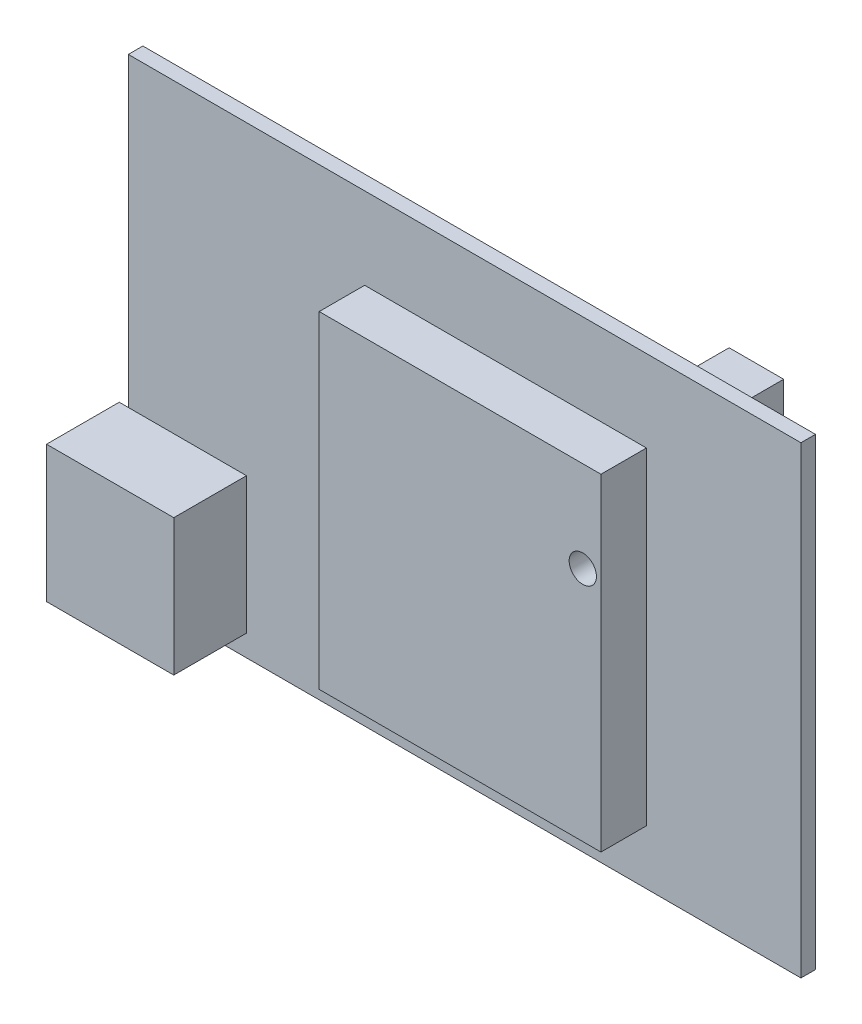
ISO-10303-21;
HEADER;
FILE_DESCRIPTION(('STEP AP214'),'2;1');
FILE_NAME('part.step','',(''),(''),'','','');
FILE_SCHEMA(('AUTOMOTIVE_DESIGN { 1 0 10303 214 1 1 1 1 }'));
ENDSEC;
DATA;
#1=APPLICATION_CONTEXT('core data for automotive mechanical design processes');
#2=APPLICATION_PROTOCOL_DEFINITION('international standard','automotive_design',2000,#1);
#3=PRODUCT_CONTEXT('',#1,'mechanical');
#4=PRODUCT('Part','Part','',(#3));
#5=PRODUCT_RELATED_PRODUCT_CATEGORY('part','',(#4));
#6=PRODUCT_DEFINITION_FORMATION('','',#4);
#7=PRODUCT_DEFINITION_CONTEXT('part definition',#1,'design');
#8=PRODUCT_DEFINITION('design','',#6,#7);
#9=PRODUCT_DEFINITION_SHAPE('','',#8);
#10=(LENGTH_UNIT() NAMED_UNIT(*) SI_UNIT(.MILLI.,.METRE.));
#11=(NAMED_UNIT(*) PLANE_ANGLE_UNIT() SI_UNIT($,.RADIAN.));
#12=(NAMED_UNIT(*) SI_UNIT($,.STERADIAN.) SOLID_ANGLE_UNIT());
#13=UNCERTAINTY_MEASURE_WITH_UNIT(LENGTH_MEASURE(1.E-05),#10,'distance_accuracy_value','');
#14=(GEOMETRIC_REPRESENTATION_CONTEXT(3) GLOBAL_UNCERTAINTY_ASSIGNED_CONTEXT((#13)) GLOBAL_UNIT_ASSIGNED_CONTEXT((#10,
#11,#12)) REPRESENTATION_CONTEXT('',''));
#15=CARTESIAN_POINT('',(0.,0.,0.));
#16=DIRECTION('',(0.,0.,1.));
#17=DIRECTION('',(1.,0.,0.));
#18=AXIS2_PLACEMENT_3D('',#15,#16,#17);
#19=CARTESIAN_POINT('',(0.,0.,0.));
#20=DIRECTION('',(0.,0.,-1.));
#21=DIRECTION('',(-1.,0.,0.));
#22=AXIS2_PLACEMENT_3D('',#19,#20,#21);
#23=PLANE('',#22);
#24=CARTESIAN_POINT('',(55.,32.,0.));
#25=DIRECTION('',(0.,0.,-1.));
#26=DIRECTION('',(-1.,0.,0.));
#27=AXIS2_PLACEMENT_3D('',#24,#25,#26);
#28=CIRCLE('',#27,1.5);
#29=CARTESIAN_POINT('',(53.5,32.,0.));
#30=VERTEX_POINT('',#29);
#31=EDGE_CURVE('E280',#30,#30,#28,.F.);
#32=ORIENTED_EDGE('',*,*,#31,.T.);
#33=EDGE_LOOP('',(#32));
#34=FACE_BOUND('',#33,.T.);
#35=CARTESIAN_POINT('',(24.,25.5,0.));
#36=DIRECTION('',(0.,0.,-1.));
#37=DIRECTION('',(-1.,0.,0.));
#38=AXIS2_PLACEMENT_3D('',#35,#36,#37);
#39=CIRCLE('',#38,1.5);
#40=CARTESIAN_POINT('',(22.5,25.5,0.));
#41=VERTEX_POINT('',#40);
#42=EDGE_CURVE('E288',#41,#41,#39,.F.);
#43=ORIENTED_EDGE('',*,*,#42,.T.);
#44=EDGE_LOOP('',(#43));
#45=FACE_BOUND('',#44,.T.);
#46=DIRECTION('',(0.,-1.,0.));
#47=VECTOR('',#46,1.);
#48=CARTESIAN_POINT('',(0.,0.,0.));
#49=LINE('',#48,#47);
#50=CARTESIAN_POINT('',(0.,51.,0.));
#51=VERTEX_POINT('',#50);
#52=CARTESIAN_POINT('',(0.,0.,0.));
#53=VERTEX_POINT('',#52);
#54=EDGE_CURVE('E251',#51,#53,#49,.T.);
#55=ORIENTED_EDGE('',*,*,#54,.F.);
#56=DIRECTION('',(-1.,0.,0.));
#57=VECTOR('',#56,1.);
#58=CARTESIAN_POINT('',(0.,51.,0.));
#59=LINE('',#58,#57);
#60=CARTESIAN_POINT('',(74.,51.,0.));
#61=VERTEX_POINT('',#60);
#62=EDGE_CURVE('E270',#61,#51,#59,.T.);
#63=ORIENTED_EDGE('',*,*,#62,.F.);
#64=DIRECTION('',(0.,1.,0.));
#65=VECTOR('',#64,1.);
#66=CARTESIAN_POINT('',(74.,0.,0.));
#67=LINE('',#66,#65);
#68=CARTESIAN_POINT('',(74.,0.,0.));
#69=VERTEX_POINT('',#68);
#70=EDGE_CURVE('E268',#69,#61,#67,.T.);
#71=ORIENTED_EDGE('',*,*,#70,.F.);
#72=DIRECTION('',(1.,0.,0.));
#73=VECTOR('',#72,1.);
#74=CARTESIAN_POINT('',(0.,0.,0.));
#75=LINE('',#74,#73);
#76=EDGE_CURVE('E266',#53,#69,#75,.T.);
#77=ORIENTED_EDGE('',*,*,#76,.F.);
#78=EDGE_LOOP('',(#55,#63,#71,#77));
#79=FACE_BOUND('',#78,.T.);
#80=DIRECTION('',(-1.,0.,0.));
#81=VECTOR('',#80,1.);
#82=CARTESIAN_POINT('',(66.,1.,0.));
#83=LINE('',#82,#81);
#84=CARTESIAN_POINT('',(66.,1.,0.));
#85=VERTEX_POINT('',#84);
#86=CARTESIAN_POINT('',(60.,1.,0.));
#87=VERTEX_POINT('',#86);
#88=EDGE_CURVE('E296',#85,#87,#83,.T.);
#89=ORIENTED_EDGE('',*,*,#88,.F.);
#90=DIRECTION('',(0.,-1.,0.));
#91=VECTOR('',#90,1.);
#92=CARTESIAN_POINT('',(66.,50.,0.));
#93=LINE('',#92,#91);
#94=CARTESIAN_POINT('',(66.,50.,0.));
#95=VERTEX_POINT('',#94);
#96=EDGE_CURVE('E179',#95,#85,#93,.T.);
#97=ORIENTED_EDGE('',*,*,#96,.F.);
#98=DIRECTION('',(1.,0.,0.));
#99=VECTOR('',#98,1.);
#100=CARTESIAN_POINT('',(66.,50.,0.));
#101=LINE('',#100,#99);
#102=CARTESIAN_POINT('',(60.,50.,0.));
#103=VERTEX_POINT('',#102);
#104=EDGE_CURVE('E175',#103,#95,#101,.T.);
#105=ORIENTED_EDGE('',*,*,#104,.F.);
#106=DIRECTION('',(0.,1.,0.));
#107=VECTOR('',#106,1.);
#108=CARTESIAN_POINT('',(60.,50.,0.));
#109=LINE('',#108,#107);
#110=EDGE_CURVE('E298',#87,#103,#109,.T.);
#111=ORIENTED_EDGE('',*,*,#110,.F.);
#112=EDGE_LOOP('',(#89,#97,#105,#111));
#113=FACE_BOUND('',#112,.T.);
#114=ADVANCED_FACE('F34',(#34,#45,#79,#113),#23,.T.);
#115=CARTESIAN_POINT('',(0.,0.,1.6));
#116=DIRECTION('',(0.,0.,-1.));
#117=DIRECTION('',(-1.,0.,0.));
#118=AXIS2_PLACEMENT_3D('',#115,#116,#117);
#119=PLANE('',#118);
#120=CARTESIAN_POINT('',(24.,25.5,1.6));
#121=DIRECTION('',(0.,0.,-1.));
#122=DIRECTION('',(-1.,0.,0.));
#123=AXIS2_PLACEMENT_3D('',#120,#121,#122);
#124=CIRCLE('',#123,1.5);
#125=CARTESIAN_POINT('',(22.5,25.5,1.6));
#126=VERTEX_POINT('',#125);
#127=EDGE_CURVE('E38',#126,#126,#124,.F.);
#128=ORIENTED_EDGE('',*,*,#127,.F.);
#129=EDGE_LOOP('',(#128));
#130=FACE_BOUND('',#129,.T.);
#131=DIRECTION('',(0.,-1.,0.));
#132=VECTOR('',#131,1.);
#133=CARTESIAN_POINT('',(26.,42.,1.6));
#134=LINE('',#133,#132);
#135=CARTESIAN_POINT('',(26.,42.,1.6));
#136=VERTEX_POINT('',#135);
#137=CARTESIAN_POINT('',(26.,6.,1.6));
#138=VERTEX_POINT('',#137);
#139=EDGE_CURVE('E218',#136,#138,#134,.T.);
#140=ORIENTED_EDGE('',*,*,#139,.F.);
#141=DIRECTION('',(-1.,0.,0.));
#142=VECTOR('',#141,1.);
#143=CARTESIAN_POINT('',(26.,42.,1.6));
#144=LINE('',#143,#142);
#145=CARTESIAN_POINT('',(57.,42.,1.6));
#146=VERTEX_POINT('',#145);
#147=EDGE_CURVE('E223',#146,#136,#144,.T.);
#148=ORIENTED_EDGE('',*,*,#147,.F.);
#149=DIRECTION('',(0.,1.,0.));
#150=VECTOR('',#149,1.);
#151=CARTESIAN_POINT('',(57.,42.,1.6));
#152=LINE('',#151,#150);
#153=CARTESIAN_POINT('',(57.,6.,1.6));
#154=VERTEX_POINT('',#153);
#155=EDGE_CURVE('E235',#154,#146,#152,.T.);
#156=ORIENTED_EDGE('',*,*,#155,.F.);
#157=DIRECTION('',(1.,0.,0.));
#158=VECTOR('',#157,1.);
#159=CARTESIAN_POINT('',(26.,6.,1.6));
#160=LINE('',#159,#158);
#161=EDGE_CURVE('E232',#138,#154,#160,.T.);
#162=ORIENTED_EDGE('',*,*,#161,.F.);
#163=EDGE_LOOP('',(#140,#148,#156,#162));
#164=FACE_BOUND('',#163,.T.);
#165=DIRECTION('',(1.,0.,0.));
#166=VECTOR('',#165,1.);
#167=CARTESIAN_POINT('',(-0.999999999999999,2.36,1.6));
#168=LINE('',#167,#166);
#169=CARTESIAN_POINT('',(0.,2.36,1.6));
#170=VERTEX_POINT('',#169);
#171=CARTESIAN_POINT('',(13.,2.36,1.6));
#172=VERTEX_POINT('',#171);
#173=EDGE_CURVE('E184',#170,#172,#168,.T.);
#174=ORIENTED_EDGE('',*,*,#173,.F.);
#175=DIRECTION('',(0.,-1.,0.));
#176=VECTOR('',#175,1.);
#177=CARTESIAN_POINT('',(0.,0.,1.6));
#178=LINE('',#177,#176);
#179=CARTESIAN_POINT('',(0.,0.,1.6));
#180=VERTEX_POINT('',#179);
#181=EDGE_CURVE('E257',#170,#180,#178,.T.);
#182=ORIENTED_EDGE('',*,*,#181,.T.);
#183=DIRECTION('',(1.,0.,0.));
#184=VECTOR('',#183,1.);
#185=CARTESIAN_POINT('',(0.,0.,1.6));
#186=LINE('',#185,#184);
#187=CARTESIAN_POINT('',(74.,0.,1.6));
#188=VERTEX_POINT('',#187);
#189=EDGE_CURVE('E255',#180,#188,#186,.T.);
#190=ORIENTED_EDGE('',*,*,#189,.T.);
#191=DIRECTION('',(0.,1.,0.));
#192=VECTOR('',#191,1.);
#193=CARTESIAN_POINT('',(74.,0.,1.6));
#194=LINE('',#193,#192);
#195=CARTESIAN_POINT('',(74.,51.,1.6));
#196=VERTEX_POINT('',#195);
#197=EDGE_CURVE('E259',#188,#196,#194,.T.);
#198=ORIENTED_EDGE('',*,*,#197,.T.);
#199=DIRECTION('',(-1.,0.,0.));
#200=VECTOR('',#199,1.);
#201=CARTESIAN_POINT('',(0.,51.,1.6));
#202=LINE('',#201,#200);
#203=CARTESIAN_POINT('',(0.,51.,1.6));
#204=VERTEX_POINT('',#203);
#205=EDGE_CURVE('E261',#196,#204,#202,.T.);
#206=ORIENTED_EDGE('',*,*,#205,.T.);
#207=CARTESIAN_POINT('',(0.,17.36,1.6));
#208=VERTEX_POINT('',#207);
#209=EDGE_CURVE('E252',#204,#208,#178,.T.);
#210=ORIENTED_EDGE('',*,*,#209,.T.);
#211=DIRECTION('',(-1.,0.,0.));
#212=VECTOR('',#211,1.);
#213=CARTESIAN_POINT('',(-1.,17.36,1.6));
#214=LINE('',#213,#212);
#215=CARTESIAN_POINT('',(13.,17.36,1.6));
#216=VERTEX_POINT('',#215);
#217=EDGE_CURVE('E193',#216,#208,#214,.T.);
#218=ORIENTED_EDGE('',*,*,#217,.F.);
#219=DIRECTION('',(0.,1.,0.));
#220=VECTOR('',#219,1.);
#221=CARTESIAN_POINT('',(13.,17.36,1.6));
#222=LINE('',#221,#220);
#223=EDGE_CURVE('E59',#172,#216,#222,.T.);
#224=ORIENTED_EDGE('',*,*,#223,.F.);
#225=EDGE_LOOP('',(#174,#182,#190,#198,#206,#210,#218,#224));
#226=FACE_BOUND('',#225,.T.);
#227=ADVANCED_FACE('F317',(#130,#164,#226),#119,.F.);
#228=CARTESIAN_POINT('',(0.,0.,1.6));
#229=DIRECTION('',(1.,0.,0.));
#230=DIRECTION('',(0.,0.,-1.));
#231=AXIS2_PLACEMENT_3D('',#228,#229,#230);
#232=PLANE('',#231);
#233=ORIENTED_EDGE('',*,*,#54,.T.);
#234=DIRECTION('',(0.,0.,-1.));
#235=VECTOR('',#234,1.);
#236=CARTESIAN_POINT('',(0.,0.,1.6));
#237=LINE('',#236,#235);
#238=EDGE_CURVE('E11',#180,#53,#237,.T.);
#239=ORIENTED_EDGE('',*,*,#238,.F.);
#240=ORIENTED_EDGE('',*,*,#181,.F.);
#241=EDGE_CURVE('E256',#208,#170,#178,.T.);
#242=ORIENTED_EDGE('',*,*,#241,.F.);
#243=ORIENTED_EDGE('',*,*,#209,.F.);
#244=DIRECTION('',(0.,0.,-1.));
#245=VECTOR('',#244,1.);
#246=CARTESIAN_POINT('',(0.,51.,1.6));
#247=LINE('',#246,#245);
#248=EDGE_CURVE('E263',#204,#51,#247,.T.);
#249=ORIENTED_EDGE('',*,*,#248,.T.);
#250=EDGE_LOOP('',(#233,#239,#240,#242,#243,#249));
#251=FACE_BOUND('',#250,.T.);
#252=ADVANCED_FACE('F36',(#251),#232,.F.);
#253=CARTESIAN_POINT('',(0.,0.,1.6));
#254=DIRECTION('',(0.,1.,0.));
#255=DIRECTION('',(0.,0.,1.));
#256=AXIS2_PLACEMENT_3D('',#253,#254,#255);
#257=PLANE('',#256);
#258=ORIENTED_EDGE('',*,*,#76,.T.);
#259=DIRECTION('',(0.,0.,-1.));
#260=VECTOR('',#259,1.);
#261=CARTESIAN_POINT('',(74.,0.,1.6));
#262=LINE('',#261,#260);
#263=EDGE_CURVE('E43',#188,#69,#262,.T.);
#264=ORIENTED_EDGE('',*,*,#263,.F.);
#265=ORIENTED_EDGE('',*,*,#189,.F.);
#266=ORIENTED_EDGE('',*,*,#238,.T.);
#267=EDGE_LOOP('',(#258,#264,#265,#266));
#268=FACE_BOUND('',#267,.T.);
#269=ADVANCED_FACE('F334',(#268),#257,.F.);
#270=CARTESIAN_POINT('',(74.,0.,1.6));
#271=DIRECTION('',(-1.,0.,0.));
#272=DIRECTION('',(0.,0.,1.));
#273=AXIS2_PLACEMENT_3D('',#270,#271,#272);
#274=PLANE('',#273);
#275=ORIENTED_EDGE('',*,*,#70,.T.);
#276=DIRECTION('',(0.,0.,-1.));
#277=VECTOR('',#276,1.);
#278=CARTESIAN_POINT('',(74.,51.,1.6));
#279=LINE('',#278,#277);
#280=EDGE_CURVE('E274',#196,#61,#279,.T.);
#281=ORIENTED_EDGE('',*,*,#280,.F.);
#282=ORIENTED_EDGE('',*,*,#197,.F.);
#283=ORIENTED_EDGE('',*,*,#263,.T.);
#284=EDGE_LOOP('',(#275,#281,#282,#283));
#285=FACE_BOUND('',#284,.T.);
#286=ADVANCED_FACE('F331',(#285),#274,.F.);
#287=CARTESIAN_POINT('',(0.,51.,1.6));
#288=DIRECTION('',(0.,-1.,0.));
#289=DIRECTION('',(0.,0.,-1.));
#290=AXIS2_PLACEMENT_3D('',#287,#288,#289);
#291=PLANE('',#290);
#292=ORIENTED_EDGE('',*,*,#62,.T.);
#293=ORIENTED_EDGE('',*,*,#248,.F.);
#294=ORIENTED_EDGE('',*,*,#205,.F.);
#295=ORIENTED_EDGE('',*,*,#280,.T.);
#296=EDGE_LOOP('',(#292,#293,#294,#295));
#297=FACE_BOUND('',#296,.T.);
#298=ADVANCED_FACE('F327',(#297),#291,.F.);
#299=CARTESIAN_POINT('',(26.,42.,6.6));
#300=DIRECTION('',(1.,0.,0.));
#301=DIRECTION('',(0.,1.,0.));
#302=AXIS2_PLACEMENT_3D('',#299,#300,#301);
#303=PLANE('',#302);
#304=ORIENTED_EDGE('',*,*,#139,.T.);
#305=DIRECTION('',(0.,0.,-1.));
#306=VECTOR('',#305,1.);
#307=CARTESIAN_POINT('',(26.,6.,6.6));
#308=LINE('',#307,#306);
#309=CARTESIAN_POINT('',(26.,6.,6.6));
#310=VERTEX_POINT('',#309);
#311=EDGE_CURVE('E248',#310,#138,#308,.T.);
#312=ORIENTED_EDGE('',*,*,#311,.F.);
#313=DIRECTION('',(0.,-1.,0.));
#314=VECTOR('',#313,1.);
#315=CARTESIAN_POINT('',(26.,42.,6.6));
#316=LINE('',#315,#314);
#317=CARTESIAN_POINT('',(26.,42.,6.6));
#318=VERTEX_POINT('',#317);
#319=EDGE_CURVE('E219',#318,#310,#316,.T.);
#320=ORIENTED_EDGE('',*,*,#319,.F.);
#321=DIRECTION('',(0.,0.,-1.));
#322=VECTOR('',#321,1.);
#323=CARTESIAN_POINT('',(26.,42.,6.6));
#324=LINE('',#323,#322);
#325=EDGE_CURVE('E229',#318,#136,#324,.T.);
#326=ORIENTED_EDGE('',*,*,#325,.T.);
#327=EDGE_LOOP('',(#304,#312,#320,#326));
#328=FACE_BOUND('',#327,.T.);
#329=ADVANCED_FACE('F330',(#328),#303,.F.);
#330=CARTESIAN_POINT('',(26.,6.,6.6));
#331=DIRECTION('',(0.,1.,0.));
#332=DIRECTION('',(0.,0.,1.));
#333=AXIS2_PLACEMENT_3D('',#330,#331,#332);
#334=PLANE('',#333);
#335=ORIENTED_EDGE('',*,*,#161,.T.);
#336=DIRECTION('',(0.,0.,-1.));
#337=VECTOR('',#336,1.);
#338=CARTESIAN_POINT('',(57.,6.,6.6));
#339=LINE('',#338,#337);
#340=CARTESIAN_POINT('',(57.,6.,6.6));
#341=VERTEX_POINT('',#340);
#342=EDGE_CURVE('E245',#341,#154,#339,.T.);
#343=ORIENTED_EDGE('',*,*,#342,.F.);
#344=DIRECTION('',(1.,0.,0.));
#345=VECTOR('',#344,1.);
#346=CARTESIAN_POINT('',(26.,6.,6.6));
#347=LINE('',#346,#345);
#348=EDGE_CURVE('E222',#310,#341,#347,.T.);
#349=ORIENTED_EDGE('',*,*,#348,.F.);
#350=ORIENTED_EDGE('',*,*,#311,.T.);
#351=EDGE_LOOP('',(#335,#343,#349,#350));
#352=FACE_BOUND('',#351,.T.);
#353=ADVANCED_FACE('F404',(#352),#334,.F.);
#354=CARTESIAN_POINT('',(57.,42.,6.6));
#355=DIRECTION('',(-1.,0.,0.));
#356=DIRECTION('',(0.,-1.,0.));
#357=AXIS2_PLACEMENT_3D('',#354,#355,#356);
#358=PLANE('',#357);
#359=ORIENTED_EDGE('',*,*,#155,.T.);
#360=DIRECTION('',(0.,0.,-1.));
#361=VECTOR('',#360,1.);
#362=CARTESIAN_POINT('',(57.,42.,6.6));
#363=LINE('',#362,#361);
#364=CARTESIAN_POINT('',(57.,42.,6.6));
#365=VERTEX_POINT('',#364);
#366=EDGE_CURVE('E242',#365,#146,#363,.T.);
#367=ORIENTED_EDGE('',*,*,#366,.F.);
#368=DIRECTION('',(0.,1.,0.));
#369=VECTOR('',#368,1.);
#370=CARTESIAN_POINT('',(57.,42.,6.6));
#371=LINE('',#370,#369);
#372=EDGE_CURVE('E225',#341,#365,#371,.T.);
#373=ORIENTED_EDGE('',*,*,#372,.F.);
#374=ORIENTED_EDGE('',*,*,#342,.T.);
#375=EDGE_LOOP('',(#359,#367,#373,#374));
#376=FACE_BOUND('',#375,.T.);
#377=ADVANCED_FACE('F400',(#376),#358,.F.);
#378=CARTESIAN_POINT('',(26.,42.,6.6));
#379=DIRECTION('',(0.,-1.,0.));
#380=DIRECTION('',(0.,0.,-1.));
#381=AXIS2_PLACEMENT_3D('',#378,#379,#380);
#382=PLANE('',#381);
#383=ORIENTED_EDGE('',*,*,#147,.T.);
#384=ORIENTED_EDGE('',*,*,#325,.F.);
#385=DIRECTION('',(-1.,0.,0.));
#386=VECTOR('',#385,1.);
#387=CARTESIAN_POINT('',(26.,42.,6.6));
#388=LINE('',#387,#386);
#389=EDGE_CURVE('E227',#365,#318,#388,.T.);
#390=ORIENTED_EDGE('',*,*,#389,.F.);
#391=ORIENTED_EDGE('',*,*,#366,.T.);
#392=EDGE_LOOP('',(#383,#384,#390,#391));
#393=FACE_BOUND('',#392,.T.);
#394=ADVANCED_FACE('F397',(#393),#382,.F.);
#395=CARTESIAN_POINT('',(0.,0.,6.6));
#396=DIRECTION('',(0.,0.,1.));
#397=DIRECTION('',(1.,0.,0.));
#398=AXIS2_PLACEMENT_3D('',#395,#396,#397);
#399=PLANE('',#398);
#400=CARTESIAN_POINT('',(55.,32.,6.6));
#401=DIRECTION('',(0.,0.,1.));
#402=DIRECTION('',(1.,0.,0.));
#403=AXIS2_PLACEMENT_3D('',#400,#401,#402);
#404=CIRCLE('',#403,1.5);
#405=CARTESIAN_POINT('',(56.5,32.,6.6));
#406=VERTEX_POINT('',#405);
#407=EDGE_CURVE('E278',#406,#406,#404,.F.);
#408=ORIENTED_EDGE('',*,*,#407,.T.);
#409=EDGE_LOOP('',(#408));
#410=FACE_BOUND('',#409,.T.);
#411=ORIENTED_EDGE('',*,*,#319,.T.);
#412=ORIENTED_EDGE('',*,*,#348,.T.);
#413=ORIENTED_EDGE('',*,*,#372,.T.);
#414=ORIENTED_EDGE('',*,*,#389,.T.);
#415=EDGE_LOOP('',(#411,#412,#413,#414));
#416=FACE_BOUND('',#415,.T.);
#417=ADVANCED_FACE('F387',(#410,#416),#399,.T.);
#418=CARTESIAN_POINT('',(0.,0.,1.6));
#419=DIRECTION('',(0.,0.,1.));
#420=DIRECTION('',(1.,0.,0.));
#421=AXIS2_PLACEMENT_3D('',#418,#419,#420);
#422=PLANE('',#421);
#423=CARTESIAN_POINT('',(-1.,17.36,1.6));
#424=VERTEX_POINT('',#423);
#425=EDGE_CURVE('E204',#208,#424,#214,.T.);
#426=ORIENTED_EDGE('',*,*,#425,.F.);
#427=ORIENTED_EDGE('',*,*,#241,.T.);
#428=CARTESIAN_POINT('',(-0.999999999999999,2.36,1.6));
#429=VERTEX_POINT('',#428);
#430=EDGE_CURVE('E200',#429,#170,#168,.T.);
#431=ORIENTED_EDGE('',*,*,#430,.F.);
#432=DIRECTION('',(0.,-1.,0.));
#433=VECTOR('',#432,1.);
#434=CARTESIAN_POINT('',(-1.,17.36,1.6));
#435=LINE('',#434,#433);
#436=EDGE_CURVE('E181',#424,#429,#435,.T.);
#437=ORIENTED_EDGE('',*,*,#436,.F.);
#438=EDGE_LOOP('',(#426,#427,#431,#437));
#439=FACE_BOUND('',#438,.T.);
#440=ADVANCED_FACE('F358',(#439),#422,.F.);
#441=CARTESIAN_POINT('',(-1.,17.36,9.6));
#442=DIRECTION('',(1.,0.,0.));
#443=DIRECTION('',(0.,1.,0.));
#444=AXIS2_PLACEMENT_3D('',#441,#442,#443);
#445=PLANE('',#444);
#446=ORIENTED_EDGE('',*,*,#436,.T.);
#447=DIRECTION('',(0.,0.,-1.));
#448=VECTOR('',#447,1.);
#449=CARTESIAN_POINT('',(-0.999999999999999,2.36,9.6));
#450=LINE('',#449,#448);
#451=CARTESIAN_POINT('',(-0.999999999999999,2.36,9.6));
#452=VERTEX_POINT('',#451);
#453=EDGE_CURVE('E215',#452,#429,#450,.T.);
#454=ORIENTED_EDGE('',*,*,#453,.F.);
#455=DIRECTION('',(0.,-1.,0.));
#456=VECTOR('',#455,1.);
#457=CARTESIAN_POINT('',(-1.,17.36,9.6));
#458=LINE('',#457,#456);
#459=CARTESIAN_POINT('',(-1.,17.36,9.6));
#460=VERTEX_POINT('',#459);
#461=EDGE_CURVE('E189',#460,#452,#458,.T.);
#462=ORIENTED_EDGE('',*,*,#461,.F.);
#463=DIRECTION('',(0.,0.,-1.));
#464=VECTOR('',#463,1.);
#465=CARTESIAN_POINT('',(-1.,17.36,9.6));
#466=LINE('',#465,#464);
#467=EDGE_CURVE('E198',#460,#424,#466,.T.);
#468=ORIENTED_EDGE('',*,*,#467,.T.);
#469=EDGE_LOOP('',(#446,#454,#462,#468));
#470=FACE_BOUND('',#469,.T.);
#471=ADVANCED_FACE('F373',(#470),#445,.F.);
#472=CARTESIAN_POINT('',(-0.999999999999999,2.36,9.6));
#473=DIRECTION('',(0.,1.,0.));
#474=DIRECTION('',(-1.,0.,0.));
#475=AXIS2_PLACEMENT_3D('',#472,#473,#474);
#476=PLANE('',#475);
#477=ORIENTED_EDGE('',*,*,#430,.T.);
#478=ORIENTED_EDGE('',*,*,#173,.T.);
#479=DIRECTION('',(0.,0.,-1.));
#480=VECTOR('',#479,1.);
#481=CARTESIAN_POINT('',(13.,2.36,9.6));
#482=LINE('',#481,#480);
#483=CARTESIAN_POINT('',(13.,2.36,9.6));
#484=VERTEX_POINT('',#483);
#485=EDGE_CURVE('E212',#484,#172,#482,.T.);
#486=ORIENTED_EDGE('',*,*,#485,.F.);
#487=DIRECTION('',(1.,0.,0.));
#488=VECTOR('',#487,1.);
#489=CARTESIAN_POINT('',(-0.999999999999999,2.36,9.6));
#490=LINE('',#489,#488);
#491=EDGE_CURVE('E192',#452,#484,#490,.T.);
#492=ORIENTED_EDGE('',*,*,#491,.F.);
#493=ORIENTED_EDGE('',*,*,#453,.T.);
#494=EDGE_LOOP('',(#477,#478,#486,#492,#493));
#495=FACE_BOUND('',#494,.T.);
#496=ADVANCED_FACE('F369',(#495),#476,.F.);
#497=CARTESIAN_POINT('',(13.,17.36,9.6));
#498=DIRECTION('',(-1.,0.,0.));
#499=DIRECTION('',(0.,-1.,0.));
#500=AXIS2_PLACEMENT_3D('',#497,#498,#499);
#501=PLANE('',#500);
#502=ORIENTED_EDGE('',*,*,#223,.T.);
#503=DIRECTION('',(0.,0.,-1.));
#504=VECTOR('',#503,1.);
#505=CARTESIAN_POINT('',(13.,17.36,9.6));
#506=LINE('',#505,#504);
#507=CARTESIAN_POINT('',(13.,17.36,9.6));
#508=VERTEX_POINT('',#507);
#509=EDGE_CURVE('E209',#508,#216,#506,.T.);
#510=ORIENTED_EDGE('',*,*,#509,.F.);
#511=DIRECTION('',(0.,1.,0.));
#512=VECTOR('',#511,1.);
#513=CARTESIAN_POINT('',(13.,17.36,9.6));
#514=LINE('',#513,#512);
#515=EDGE_CURVE('E195',#484,#508,#514,.T.);
#516=ORIENTED_EDGE('',*,*,#515,.F.);
#517=ORIENTED_EDGE('',*,*,#485,.T.);
#518=EDGE_LOOP('',(#502,#510,#516,#517));
#519=FACE_BOUND('',#518,.T.);
#520=ADVANCED_FACE('F366',(#519),#501,.F.);
#521=CARTESIAN_POINT('',(-1.,17.36,9.6));
#522=DIRECTION('',(0.,-1.,0.));
#523=DIRECTION('',(0.,0.,-1.));
#524=AXIS2_PLACEMENT_3D('',#521,#522,#523);
#525=PLANE('',#524);
#526=ORIENTED_EDGE('',*,*,#217,.T.);
#527=ORIENTED_EDGE('',*,*,#425,.T.);
#528=ORIENTED_EDGE('',*,*,#467,.F.);
#529=DIRECTION('',(-1.,0.,0.));
#530=VECTOR('',#529,1.);
#531=CARTESIAN_POINT('',(-1.,17.36,9.6));
#532=LINE('',#531,#530);
#533=EDGE_CURVE('E197',#508,#460,#532,.T.);
#534=ORIENTED_EDGE('',*,*,#533,.F.);
#535=ORIENTED_EDGE('',*,*,#509,.T.);
#536=EDGE_LOOP('',(#526,#527,#528,#534,#535));
#537=FACE_BOUND('',#536,.T.);
#538=ADVANCED_FACE('F361',(#537),#525,.F.);
#539=CARTESIAN_POINT('',(0.,0.,9.6));
#540=DIRECTION('',(0.,0.,1.));
#541=DIRECTION('',(1.,0.,0.));
#542=AXIS2_PLACEMENT_3D('',#539,#540,#541);
#543=PLANE('',#542);
#544=ORIENTED_EDGE('',*,*,#461,.T.);
#545=ORIENTED_EDGE('',*,*,#491,.T.);
#546=ORIENTED_EDGE('',*,*,#515,.T.);
#547=ORIENTED_EDGE('',*,*,#533,.T.);
#548=EDGE_LOOP('',(#544,#545,#546,#547));
#549=FACE_BOUND('',#548,.T.);
#550=ADVANCED_FACE('F375',(#549),#543,.T.);
#551=CARTESIAN_POINT('',(66.,50.,-4.5));
#552=DIRECTION('',(-1.,0.,0.));
#553=DIRECTION('',(0.,0.,1.));
#554=AXIS2_PLACEMENT_3D('',#551,#552,#553);
#555=PLANE('',#554);
#556=ORIENTED_EDGE('',*,*,#96,.T.);
#557=DIRECTION('',(0.,0.,1.));
#558=VECTOR('',#557,1.);
#559=CARTESIAN_POINT('',(66.,1.,-4.5));
#560=LINE('',#559,#558);
#561=CARTESIAN_POINT('',(66.,1.,-4.5));
#562=VERTEX_POINT('',#561);
#563=EDGE_CURVE('E160',#562,#85,#560,.T.);
#564=ORIENTED_EDGE('',*,*,#563,.F.);
#565=DIRECTION('',(0.,-1.,0.));
#566=VECTOR('',#565,1.);
#567=CARTESIAN_POINT('',(66.,50.,-4.5));
#568=LINE('',#567,#566);
#569=CARTESIAN_POINT('',(66.,50.,-4.5));
#570=VERTEX_POINT('',#569);
#571=EDGE_CURVE('E167',#570,#562,#568,.T.);
#572=ORIENTED_EDGE('',*,*,#571,.F.);
#573=DIRECTION('',(0.,0.,1.));
#574=VECTOR('',#573,1.);
#575=CARTESIAN_POINT('',(66.,50.,-4.5));
#576=LINE('',#575,#574);
#577=EDGE_CURVE('E294',#570,#95,#576,.T.);
#578=ORIENTED_EDGE('',*,*,#577,.T.);
#579=EDGE_LOOP('',(#556,#564,#572,#578));
#580=FACE_BOUND('',#579,.T.);
#581=ADVANCED_FACE('F177',(#580),#555,.F.);
#582=CARTESIAN_POINT('',(66.,1.,-4.5));
#583=DIRECTION('',(0.,1.,0.));
#584=DIRECTION('',(0.,0.,1.));
#585=AXIS2_PLACEMENT_3D('',#582,#583,#584);
#586=PLANE('',#585);
#587=ORIENTED_EDGE('',*,*,#88,.T.);
#588=DIRECTION('',(0.,0.,1.));
#589=VECTOR('',#588,1.);
#590=CARTESIAN_POINT('',(60.,1.,-4.5));
#591=LINE('',#590,#589);
#592=CARTESIAN_POINT('',(60.,1.,-4.5));
#593=VERTEX_POINT('',#592);
#594=EDGE_CURVE('E163',#593,#87,#591,.T.);
#595=ORIENTED_EDGE('',*,*,#594,.F.);
#596=DIRECTION('',(-1.,0.,0.));
#597=VECTOR('',#596,1.);
#598=CARTESIAN_POINT('',(66.,1.,-4.5));
#599=LINE('',#598,#597);
#600=EDGE_CURVE('E156',#562,#593,#599,.T.);
#601=ORIENTED_EDGE('',*,*,#600,.F.);
#602=ORIENTED_EDGE('',*,*,#563,.T.);
#603=EDGE_LOOP('',(#587,#595,#601,#602));
#604=FACE_BOUND('',#603,.T.);
#605=ADVANCED_FACE('F158',(#604),#586,.F.);
#606=CARTESIAN_POINT('',(60.,50.,-4.5));
#607=DIRECTION('',(1.,0.,0.));
#608=DIRECTION('',(0.,1.,0.));
#609=AXIS2_PLACEMENT_3D('',#606,#607,#608);
#610=PLANE('',#609);
#611=ORIENTED_EDGE('',*,*,#110,.T.);
#612=DIRECTION('',(0.,0.,1.));
#613=VECTOR('',#612,1.);
#614=CARTESIAN_POINT('',(60.,50.,-4.5));
#615=LINE('',#614,#613);
#616=CARTESIAN_POINT('',(60.,50.,-4.5));
#617=VERTEX_POINT('',#616);
#618=EDGE_CURVE('E51',#617,#103,#615,.T.);
#619=ORIENTED_EDGE('',*,*,#618,.F.);
#620=DIRECTION('',(0.,1.,0.));
#621=VECTOR('',#620,1.);
#622=CARTESIAN_POINT('',(60.,50.,-4.5));
#623=LINE('',#622,#621);
#624=EDGE_CURVE('E166',#593,#617,#623,.T.);
#625=ORIENTED_EDGE('',*,*,#624,.F.);
#626=ORIENTED_EDGE('',*,*,#594,.T.);
#627=EDGE_LOOP('',(#611,#619,#625,#626));
#628=FACE_BOUND('',#627,.T.);
#629=ADVANCED_FACE('F305',(#628),#610,.F.);
#630=CARTESIAN_POINT('',(66.,50.,-4.5));
#631=DIRECTION('',(0.,-1.,0.));
#632=DIRECTION('',(0.,0.,-1.));
#633=AXIS2_PLACEMENT_3D('',#630,#631,#632);
#634=PLANE('',#633);
#635=ORIENTED_EDGE('',*,*,#104,.T.);
#636=ORIENTED_EDGE('',*,*,#577,.F.);
#637=DIRECTION('',(1.,0.,0.));
#638=VECTOR('',#637,1.);
#639=CARTESIAN_POINT('',(66.,50.,-4.5));
#640=LINE('',#639,#638);
#641=EDGE_CURVE('E171',#617,#570,#640,.T.);
#642=ORIENTED_EDGE('',*,*,#641,.F.);
#643=ORIENTED_EDGE('',*,*,#618,.T.);
#644=EDGE_LOOP('',(#635,#636,#642,#643));
#645=FACE_BOUND('',#644,.T.);
#646=ADVANCED_FACE('F306',(#645),#634,.F.);
#647=CARTESIAN_POINT('',(0.,0.,-4.5));
#648=DIRECTION('',(0.,0.,-1.));
#649=DIRECTION('',(-1.,0.,0.));
#650=AXIS2_PLACEMENT_3D('',#647,#648,#649);
#651=PLANE('',#650);
#652=ORIENTED_EDGE('',*,*,#571,.T.);
#653=ORIENTED_EDGE('',*,*,#600,.T.);
#654=ORIENTED_EDGE('',*,*,#624,.T.);
#655=ORIENTED_EDGE('',*,*,#641,.T.);
#656=EDGE_LOOP('',(#652,#653,#654,#655));
#657=FACE_BOUND('',#656,.T.);
#658=ADVANCED_FACE('F170',(#657),#651,.T.);
#659=CARTESIAN_POINT('',(55.,32.,10.1));
#660=DIRECTION('',(0.,0.,-1.));
#661=DIRECTION('',(-1.,0.,0.));
#662=AXIS2_PLACEMENT_3D('',#659,#660,#661);
#663=CYLINDRICAL_SURFACE('',#662,1.5);
#664=ORIENTED_EDGE('',*,*,#31,.F.);
#665=EDGE_LOOP('',(#664));
#666=FACE_BOUND('',#665,.T.);
#667=ORIENTED_EDGE('',*,*,#407,.F.);
#668=EDGE_LOOP('',(#667));
#669=FACE_BOUND('',#668,.T.);
#670=ADVANCED_FACE('F313',(#666,#669),#663,.F.);
#671=CARTESIAN_POINT('',(24.,25.5,10.1));
#672=DIRECTION('',(0.,0.,-1.));
#673=DIRECTION('',(-1.,0.,0.));
#674=AXIS2_PLACEMENT_3D('',#671,#672,#673);
#675=CYLINDRICAL_SURFACE('',#674,1.5);
#676=ORIENTED_EDGE('',*,*,#42,.F.);
#677=EDGE_LOOP('',(#676));
#678=FACE_BOUND('',#677,.T.);
#679=ORIENTED_EDGE('',*,*,#127,.T.);
#680=EDGE_LOOP('',(#679));
#681=FACE_BOUND('',#680,.T.);
#682=ADVANCED_FACE('F551',(#678,#681),#675,.F.);
#683=CLOSED_SHELL('',(#114,#227,#252,#269,#286,#298,#329,#353,#377,#394,#417,#440,#471,#496,
#520,#538,#550,#581,#605,#629,#646,#658,#670,#682));
#684=MANIFOLD_SOLID_BREP('B2',#683);
#685=ADVANCED_BREP_SHAPE_REPRESENTATION('',(#18,#684),#14);
#686=SHAPE_DEFINITION_REPRESENTATION(#9,#685);
ENDSEC;
END-ISO-10303-21;
